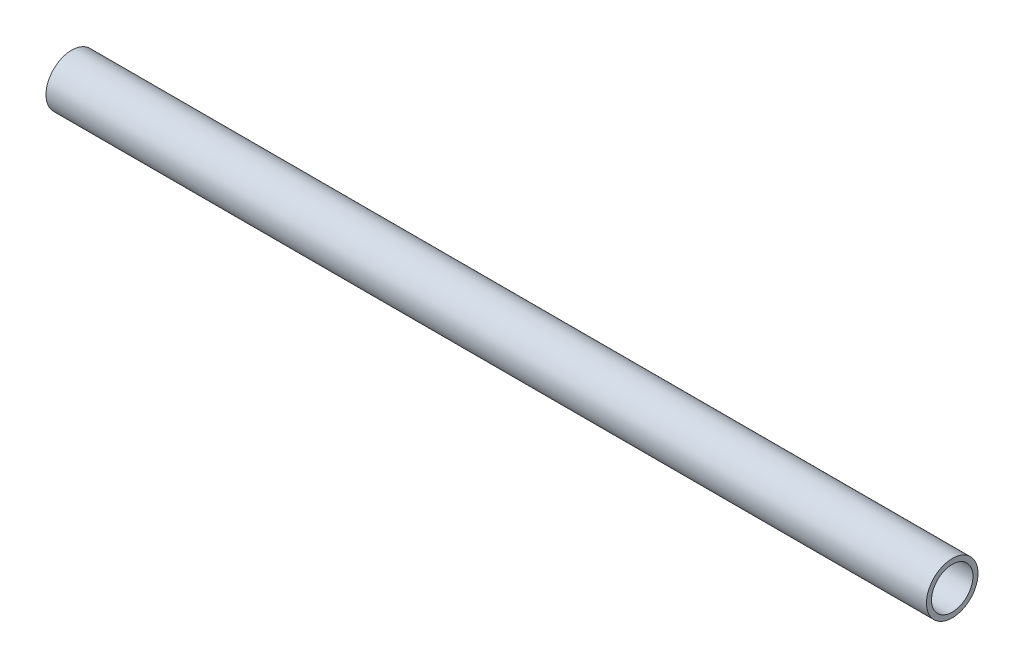
ISO-10303-21;
HEADER;
FILE_DESCRIPTION(('STEP AP214'),'2;1');
FILE_NAME('part.step','',(''),(''),'','','');
FILE_SCHEMA(('AUTOMOTIVE_DESIGN { 1 0 10303 214 1 1 1 1 }'));
ENDSEC;
DATA;
#1=APPLICATION_CONTEXT('core data for automotive mechanical design processes');
#2=APPLICATION_PROTOCOL_DEFINITION('international standard','automotive_design',2000,#1);
#3=PRODUCT_CONTEXT('',#1,'mechanical');
#4=PRODUCT('Part','Part','',(#3));
#5=PRODUCT_RELATED_PRODUCT_CATEGORY('part','',(#4));
#6=PRODUCT_DEFINITION_FORMATION('','',#4);
#7=PRODUCT_DEFINITION_CONTEXT('part definition',#1,'design');
#8=PRODUCT_DEFINITION('design','',#6,#7);
#9=PRODUCT_DEFINITION_SHAPE('','',#8);
#10=(LENGTH_UNIT() NAMED_UNIT(*) SI_UNIT(.MILLI.,.METRE.));
#11=(NAMED_UNIT(*) PLANE_ANGLE_UNIT() SI_UNIT($,.RADIAN.));
#12=(NAMED_UNIT(*) SI_UNIT($,.STERADIAN.) SOLID_ANGLE_UNIT());
#13=UNCERTAINTY_MEASURE_WITH_UNIT(LENGTH_MEASURE(1.E-05),#10,'distance_accuracy_value','');
#14=(GEOMETRIC_REPRESENTATION_CONTEXT(3) GLOBAL_UNCERTAINTY_ASSIGNED_CONTEXT((#13)) GLOBAL_UNIT_ASSIGNED_CONTEXT((#10,
#11,#12)) REPRESENTATION_CONTEXT('',''));
#15=CARTESIAN_POINT('',(0.,0.,0.));
#16=DIRECTION('',(0.,0.,1.));
#17=DIRECTION('',(1.,0.,0.));
#18=AXIS2_PLACEMENT_3D('',#15,#16,#17);
#19=CARTESIAN_POINT('',(87.15,0.,0.));
#20=DIRECTION('',(1.,0.,0.));
#21=DIRECTION('',(0.,0.,-1.));
#22=AXIS2_PLACEMENT_3D('',#19,#20,#21);
#23=PLANE('',#22);
#24=CARTESIAN_POINT('',(87.15,0.,0.));
#25=DIRECTION('',(1.,0.,0.));
#26=DIRECTION('',(0.,0.,-1.));
#27=AXIS2_PLACEMENT_3D('',#24,#25,#26);
#28=CIRCLE('',#27,2.55);
#29=CARTESIAN_POINT('',(87.15,0.,-2.55));
#30=VERTEX_POINT('',#29);
#31=EDGE_CURVE('E10',#30,#30,#28,.T.);
#32=ORIENTED_EDGE('',*,*,#31,.T.);
#33=EDGE_LOOP('',(#32));
#34=FACE_BOUND('',#33,.T.);
#35=CARTESIAN_POINT('',(87.15,0.,0.));
#36=DIRECTION('',(1.,0.,0.));
#37=DIRECTION('',(0.,0.,-1.));
#38=AXIS2_PLACEMENT_3D('',#35,#36,#37);
#39=CIRCLE('',#38,2.05);
#40=CARTESIAN_POINT('',(87.15,0.,-2.05));
#41=VERTEX_POINT('',#40);
#42=EDGE_CURVE('E50',#41,#41,#39,.T.);
#43=ORIENTED_EDGE('',*,*,#42,.F.);
#44=EDGE_LOOP('',(#43));
#45=FACE_BOUND('',#44,.T.);
#46=ADVANCED_FACE('F39',(#34,#45),#23,.T.);
#47=CARTESIAN_POINT('',(0.,0.,0.));
#48=DIRECTION('',(1.,0.,0.));
#49=DIRECTION('',(0.,0.,-1.));
#50=AXIS2_PLACEMENT_3D('',#47,#48,#49);
#51=PLANE('',#50);
#52=CARTESIAN_POINT('',(0.,0.,0.));
#53=DIRECTION('',(1.,0.,0.));
#54=DIRECTION('',(0.,0.,-1.));
#55=AXIS2_PLACEMENT_3D('',#52,#53,#54);
#56=CIRCLE('',#55,2.55);
#57=CARTESIAN_POINT('',(0.,0.,-2.55));
#58=VERTEX_POINT('',#57);
#59=EDGE_CURVE('E43',#58,#58,#56,.T.);
#60=ORIENTED_EDGE('',*,*,#59,.F.);
#61=EDGE_LOOP('',(#60));
#62=FACE_BOUND('',#61,.T.);
#63=CARTESIAN_POINT('',(0.,0.,0.));
#64=DIRECTION('',(1.,0.,0.));
#65=DIRECTION('',(0.,0.,-1.));
#66=AXIS2_PLACEMENT_3D('',#63,#64,#65);
#67=CIRCLE('',#66,2.05);
#68=CARTESIAN_POINT('',(0.,0.,-2.05));
#69=VERTEX_POINT('',#68);
#70=EDGE_CURVE('E52',#69,#69,#67,.T.);
#71=ORIENTED_EDGE('',*,*,#70,.T.);
#72=EDGE_LOOP('',(#71));
#73=FACE_BOUND('',#72,.T.);
#74=ADVANCED_FACE('F62',(#62,#73),#51,.F.);
#75=CARTESIAN_POINT('',(87.15,0.,0.));
#76=DIRECTION('',(-1.,0.,0.));
#77=DIRECTION('',(0.,0.,1.));
#78=AXIS2_PLACEMENT_3D('',#75,#76,#77);
#79=CYLINDRICAL_SURFACE('',#78,2.55);
#80=ORIENTED_EDGE('',*,*,#31,.F.);
#81=EDGE_LOOP('',(#80));
#82=FACE_BOUND('',#81,.T.);
#83=ORIENTED_EDGE('',*,*,#59,.T.);
#84=EDGE_LOOP('',(#83));
#85=FACE_BOUND('',#84,.T.);
#86=ADVANCED_FACE('F41',(#82,#85),#79,.T.);
#87=CARTESIAN_POINT('',(87.15,0.,0.));
#88=DIRECTION('',(-1.,0.,0.));
#89=DIRECTION('',(0.,0.,1.));
#90=AXIS2_PLACEMENT_3D('',#87,#88,#89);
#91=CYLINDRICAL_SURFACE('',#90,2.05);
#92=ORIENTED_EDGE('',*,*,#42,.T.);
#93=EDGE_LOOP('',(#92));
#94=FACE_BOUND('',#93,.T.);
#95=ORIENTED_EDGE('',*,*,#70,.F.);
#96=EDGE_LOOP('',(#95));
#97=FACE_BOUND('',#96,.T.);
#98=ADVANCED_FACE('F58',(#94,#97),#91,.F.);
#99=CLOSED_SHELL('',(#46,#74,#86,#98));
#100=MANIFOLD_SOLID_BREP('B2',#99);
#101=ADVANCED_BREP_SHAPE_REPRESENTATION('',(#18,#100),#14);
#102=SHAPE_DEFINITION_REPRESENTATION(#9,#101);
ENDSEC;
END-ISO-10303-21;
